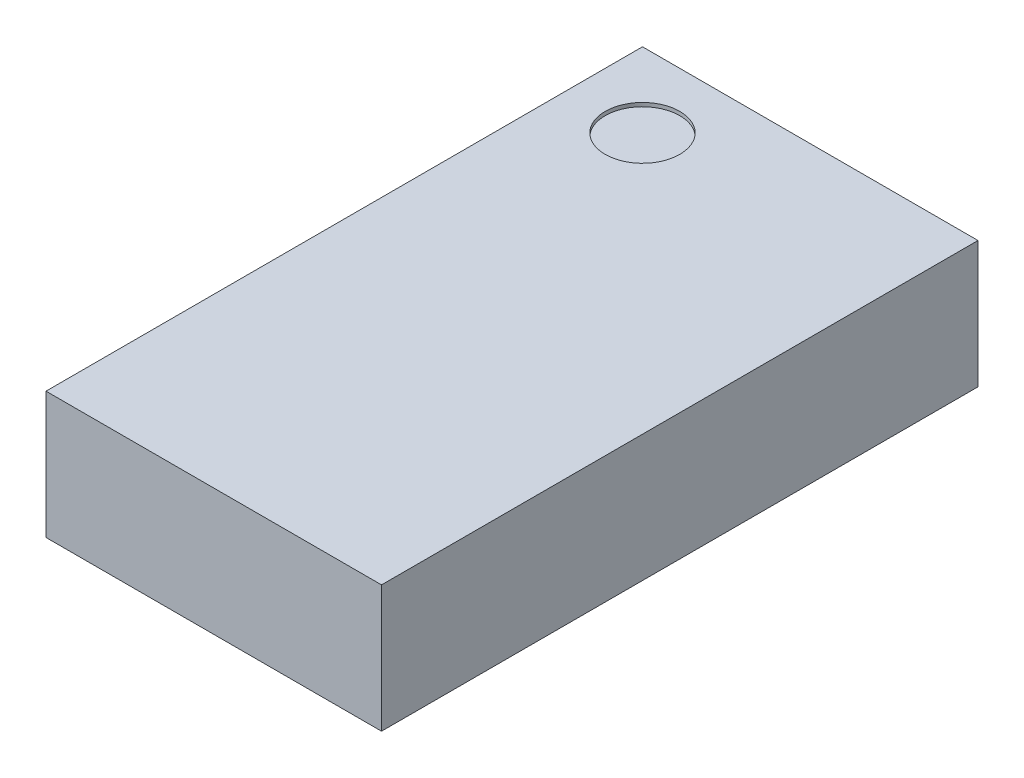
ISO-10303-21;
HEADER;
FILE_DESCRIPTION(('STEP AP214'),'2;1');
FILE_NAME('part.step','',(''),(''),'','','');
FILE_SCHEMA(('AUTOMOTIVE_DESIGN { 1 0 10303 214 1 1 1 1 }'));
ENDSEC;
DATA;
#1=APPLICATION_CONTEXT('core data for automotive mechanical design processes');
#2=APPLICATION_PROTOCOL_DEFINITION('international standard','automotive_design',2000,#1);
#3=PRODUCT_CONTEXT('',#1,'mechanical');
#4=PRODUCT('Part','Part','',(#3));
#5=PRODUCT_RELATED_PRODUCT_CATEGORY('part','',(#4));
#6=PRODUCT_DEFINITION_FORMATION('','',#4);
#7=PRODUCT_DEFINITION_CONTEXT('part definition',#1,'design');
#8=PRODUCT_DEFINITION('design','',#6,#7);
#9=PRODUCT_DEFINITION_SHAPE('','',#8);
#10=(LENGTH_UNIT() NAMED_UNIT(*) SI_UNIT(.MILLI.,.METRE.));
#11=(NAMED_UNIT(*) PLANE_ANGLE_UNIT() SI_UNIT($,.RADIAN.));
#12=(NAMED_UNIT(*) SI_UNIT($,.STERADIAN.) SOLID_ANGLE_UNIT());
#13=UNCERTAINTY_MEASURE_WITH_UNIT(LENGTH_MEASURE(1.E-05),#10,'distance_accuracy_value','');
#14=(GEOMETRIC_REPRESENTATION_CONTEXT(3) GLOBAL_UNCERTAINTY_ASSIGNED_CONTEXT((#13)) GLOBAL_UNIT_ASSIGNED_CONTEXT((#10,
#11,#12)) REPRESENTATION_CONTEXT('',''));
#15=CARTESIAN_POINT('',(0.,0.,0.));
#16=DIRECTION('',(0.,0.,1.));
#17=DIRECTION('',(1.,0.,0.));
#18=AXIS2_PLACEMENT_3D('',#15,#16,#17);
#19=CARTESIAN_POINT('',(0.45,2.83575597506858,0.8));
#20=DIRECTION('',(-1.,0.,0.));
#21=DIRECTION('',(0.,0.,1.));
#22=AXIS2_PLACEMENT_3D('',#19,#20,#21);
#23=PLANE('',#22);
#24=DIRECTION('',(0.,0.,-1.));
#25=VECTOR('',#24,1.);
#26=CARTESIAN_POINT('',(0.45,0.5,0.8));
#27=LINE('',#26,#25);
#28=CARTESIAN_POINT('',(0.45,0.5,0.8));
#29=VERTEX_POINT('',#28);
#30=CARTESIAN_POINT('',(0.45,0.5,-0.8));
#31=VERTEX_POINT('',#30);
#32=EDGE_CURVE('E96',#29,#31,#27,.T.);
#33=ORIENTED_EDGE('',*,*,#32,.F.);
#34=DIRECTION('',(0.,-1.,0.));
#35=VECTOR('',#34,1.);
#36=CARTESIAN_POINT('',(0.45,2.83575597506858,0.8));
#37=LINE('',#36,#35);
#38=CARTESIAN_POINT('',(0.45,0.16,0.8));
#39=VERTEX_POINT('',#38);
#40=EDGE_CURVE('E61',#29,#39,#37,.T.);
#41=ORIENTED_EDGE('',*,*,#40,.T.);
#42=DIRECTION('',(0.,0.,-1.));
#43=VECTOR('',#42,1.);
#44=CARTESIAN_POINT('',(0.45,0.16,0.8));
#45=LINE('',#44,#43);
#46=CARTESIAN_POINT('',(0.45,0.16,-0.8));
#47=VERTEX_POINT('',#46);
#48=EDGE_CURVE('E94',#39,#47,#45,.T.);
#49=ORIENTED_EDGE('',*,*,#48,.T.);
#50=DIRECTION('',(0.,-1.,0.));
#51=VECTOR('',#50,1.);
#52=CARTESIAN_POINT('',(0.45,2.83575597506858,-0.8));
#53=LINE('',#52,#51);
#54=EDGE_CURVE('E84',#31,#47,#53,.T.);
#55=ORIENTED_EDGE('',*,*,#54,.F.);
#56=EDGE_LOOP('',(#33,#41,#49,#55));
#57=FACE_BOUND('',#56,.T.);
#58=ADVANCED_FACE('F46',(#57),#23,.F.);
#59=CARTESIAN_POINT('',(-0.45,2.83575597506858,-0.8));
#60=DIRECTION('',(0.,0.,1.));
#61=DIRECTION('',(1.,0.,0.));
#62=AXIS2_PLACEMENT_3D('',#59,#60,#61);
#63=PLANE('',#62);
#64=DIRECTION('',(-1.,0.,0.));
#65=VECTOR('',#64,1.);
#66=CARTESIAN_POINT('',(-0.45,0.5,-0.8));
#67=LINE('',#66,#65);
#68=CARTESIAN_POINT('',(-0.45,0.5,-0.8));
#69=VERTEX_POINT('',#68);
#70=EDGE_CURVE('E90',#31,#69,#67,.T.);
#71=ORIENTED_EDGE('',*,*,#70,.F.);
#72=ORIENTED_EDGE('',*,*,#54,.T.);
#73=DIRECTION('',(-1.,0.,0.));
#74=VECTOR('',#73,1.);
#75=CARTESIAN_POINT('',(-0.45,0.16,-0.8));
#76=LINE('',#75,#74);
#77=CARTESIAN_POINT('',(-0.45,0.16,-0.8));
#78=VERTEX_POINT('',#77);
#79=EDGE_CURVE('E108',#47,#78,#76,.T.);
#80=ORIENTED_EDGE('',*,*,#79,.T.);
#81=DIRECTION('',(0.,-1.,0.));
#82=VECTOR('',#81,1.);
#83=CARTESIAN_POINT('',(-0.45,2.83575597506858,-0.8));
#84=LINE('',#83,#82);
#85=EDGE_CURVE('E121',#69,#78,#84,.T.);
#86=ORIENTED_EDGE('',*,*,#85,.F.);
#87=EDGE_LOOP('',(#71,#72,#80,#86));
#88=FACE_BOUND('',#87,.T.);
#89=ADVANCED_FACE('F168',(#88),#63,.F.);
#90=CARTESIAN_POINT('',(-0.45,2.83575597506858,0.8));
#91=DIRECTION('',(1.,0.,0.));
#92=DIRECTION('',(0.,0.,-1.));
#93=AXIS2_PLACEMENT_3D('',#90,#91,#92);
#94=PLANE('',#93);
#95=DIRECTION('',(0.,0.,1.));
#96=VECTOR('',#95,1.);
#97=CARTESIAN_POINT('',(-0.45,0.5,0.8));
#98=LINE('',#97,#96);
#99=CARTESIAN_POINT('',(-0.45,0.5,0.8));
#100=VERTEX_POINT('',#99);
#101=EDGE_CURVE('E114',#69,#100,#98,.T.);
#102=ORIENTED_EDGE('',*,*,#101,.F.);
#103=ORIENTED_EDGE('',*,*,#85,.T.);
#104=DIRECTION('',(0.,0.,1.));
#105=VECTOR('',#104,1.);
#106=CARTESIAN_POINT('',(-0.45,0.16,0.8));
#107=LINE('',#106,#105);
#108=CARTESIAN_POINT('',(-0.45,0.16,0.8));
#109=VERTEX_POINT('',#108);
#110=EDGE_CURVE('E123',#78,#109,#107,.T.);
#111=ORIENTED_EDGE('',*,*,#110,.T.);
#112=DIRECTION('',(0.,-1.,0.));
#113=VECTOR('',#112,1.);
#114=CARTESIAN_POINT('',(-0.45,2.83575597506858,0.8));
#115=LINE('',#114,#113);
#116=EDGE_CURVE('E67',#100,#109,#115,.T.);
#117=ORIENTED_EDGE('',*,*,#116,.F.);
#118=EDGE_LOOP('',(#102,#103,#111,#117));
#119=FACE_BOUND('',#118,.T.);
#120=ADVANCED_FACE('F172',(#119),#94,.F.);
#121=CARTESIAN_POINT('',(-0.45,2.83575597506858,0.8));
#122=DIRECTION('',(0.,0.,-1.));
#123=DIRECTION('',(-1.,0.,0.));
#124=AXIS2_PLACEMENT_3D('',#121,#122,#123);
#125=PLANE('',#124);
#126=DIRECTION('',(1.,0.,0.));
#127=VECTOR('',#126,1.);
#128=CARTESIAN_POINT('',(-0.45,0.5,0.8));
#129=LINE('',#128,#127);
#130=EDGE_CURVE('E105',#100,#29,#129,.T.);
#131=ORIENTED_EDGE('',*,*,#130,.F.);
#132=ORIENTED_EDGE('',*,*,#116,.T.);
#133=DIRECTION('',(1.,0.,0.));
#134=VECTOR('',#133,1.);
#135=CARTESIAN_POINT('',(-0.45,0.16,0.8));
#136=LINE('',#135,#134);
#137=EDGE_CURVE('E101',#109,#39,#136,.T.);
#138=ORIENTED_EDGE('',*,*,#137,.T.);
#139=ORIENTED_EDGE('',*,*,#40,.F.);
#140=EDGE_LOOP('',(#131,#132,#138,#139));
#141=FACE_BOUND('',#140,.T.);
#142=ADVANCED_FACE('F102',(#141),#125,.F.);
#143=CARTESIAN_POINT('',(0.,0.16,0.));
#144=DIRECTION('',(0.,-1.,0.));
#145=DIRECTION('',(0.,0.,-1.));
#146=AXIS2_PLACEMENT_3D('',#143,#144,#145);
#147=PLANE('',#146);
#148=CARTESIAN_POINT('',(0.2,0.16,-0.4));
#149=DIRECTION('',(0.,-1.,0.));
#150=DIRECTION('',(0.,0.,-1.));
#151=AXIS2_PLACEMENT_3D('',#148,#149,#150);
#152=CIRCLE('',#151,0.105830052442584);
#153=CARTESIAN_POINT('',(0.2,0.16,-0.505830052442584));
#154=VERTEX_POINT('',#153);
#155=EDGE_CURVE('E12',#154,#154,#152,.T.);
#156=ORIENTED_EDGE('',*,*,#155,.F.);
#157=EDGE_LOOP('',(#156));
#158=FACE_BOUND('',#157,.T.);
#159=CARTESIAN_POINT('',(0.2,0.16,0.4));
#160=DIRECTION('',(0.,-1.,0.));
#161=DIRECTION('',(0.,0.,-1.));
#162=AXIS2_PLACEMENT_3D('',#159,#160,#161);
#163=CIRCLE('',#162,0.105830052442584);
#164=CARTESIAN_POINT('',(0.2,0.16,0.294169947557416));
#165=VERTEX_POINT('',#164);
#166=EDGE_CURVE('E54',#165,#165,#163,.T.);
#167=ORIENTED_EDGE('',*,*,#166,.F.);
#168=EDGE_LOOP('',(#167));
#169=FACE_BOUND('',#168,.T.);
#170=CARTESIAN_POINT('',(0.2,0.16,0.));
#171=DIRECTION('',(0.,-1.,0.));
#172=DIRECTION('',(0.,0.,-1.));
#173=AXIS2_PLACEMENT_3D('',#170,#171,#172);
#174=CIRCLE('',#173,0.105830052442584);
#175=CARTESIAN_POINT('',(0.2,0.16,-0.105830052442584));
#176=VERTEX_POINT('',#175);
#177=EDGE_CURVE('E133',#176,#176,#174,.T.);
#178=ORIENTED_EDGE('',*,*,#177,.F.);
#179=EDGE_LOOP('',(#178));
#180=FACE_BOUND('',#179,.T.);
#181=CARTESIAN_POINT('',(-0.2,0.16,-0.4));
#182=DIRECTION('',(0.,-1.,0.));
#183=DIRECTION('',(0.,0.,-1.));
#184=AXIS2_PLACEMENT_3D('',#181,#182,#183);
#185=CIRCLE('',#184,0.105830052442584);
#186=CARTESIAN_POINT('',(-0.2,0.16,-0.505830052442584));
#187=VERTEX_POINT('',#186);
#188=EDGE_CURVE('E130',#187,#187,#185,.T.);
#189=ORIENTED_EDGE('',*,*,#188,.F.);
#190=EDGE_LOOP('',(#189));
#191=FACE_BOUND('',#190,.T.);
#192=CARTESIAN_POINT('',(-0.2,0.16,0.4));
#193=DIRECTION('',(0.,-1.,0.));
#194=DIRECTION('',(0.,0.,-1.));
#195=AXIS2_PLACEMENT_3D('',#192,#193,#194);
#196=CIRCLE('',#195,0.105830052442584);
#197=CARTESIAN_POINT('',(-0.2,0.16,0.294169947557416));
#198=VERTEX_POINT('',#197);
#199=EDGE_CURVE('E127',#198,#198,#196,.T.);
#200=ORIENTED_EDGE('',*,*,#199,.F.);
#201=EDGE_LOOP('',(#200));
#202=FACE_BOUND('',#201,.T.);
#203=CARTESIAN_POINT('',(-0.2,0.16,0.));
#204=DIRECTION('',(0.,-1.,0.));
#205=DIRECTION('',(0.,0.,-1.));
#206=AXIS2_PLACEMENT_3D('',#203,#204,#205);
#207=CIRCLE('',#206,0.105830052442584);
#208=CARTESIAN_POINT('',(-0.2,0.16,-0.105830052442584));
#209=VERTEX_POINT('',#208);
#210=EDGE_CURVE('E117',#209,#209,#207,.T.);
#211=ORIENTED_EDGE('',*,*,#210,.F.);
#212=EDGE_LOOP('',(#211));
#213=FACE_BOUND('',#212,.T.);
#214=ORIENTED_EDGE('',*,*,#48,.F.);
#215=ORIENTED_EDGE('',*,*,#137,.F.);
#216=ORIENTED_EDGE('',*,*,#110,.F.);
#217=ORIENTED_EDGE('',*,*,#79,.F.);
#218=EDGE_LOOP('',(#214,#215,#216,#217));
#219=FACE_BOUND('',#218,.T.);
#220=ADVANCED_FACE('F107',(#158,#169,#180,#191,#202,#213,#219),#147,.T.);
#221=CARTESIAN_POINT('',(0.,0.5,0.));
#222=DIRECTION('',(0.,1.,0.));
#223=DIRECTION('',(0.,0.,1.));
#224=AXIS2_PLACEMENT_3D('',#221,#222,#223);
#225=PLANE('',#224);
#226=CARTESIAN_POINT('',(-0.25,0.5,-0.6));
#227=DIRECTION('',(0.,1.,0.));
#228=DIRECTION('',(0.,0.,1.));
#229=AXIS2_PLACEMENT_3D('',#226,#227,#228);
#230=CIRCLE('',#229,0.1);
#231=CARTESIAN_POINT('',(-0.25,0.5,-0.5));
#232=VERTEX_POINT('',#231);
#233=EDGE_CURVE('E192',#232,#232,#230,.T.);
#234=ORIENTED_EDGE('',*,*,#233,.F.);
#235=EDGE_LOOP('',(#234));
#236=FACE_BOUND('',#235,.T.);
#237=ORIENTED_EDGE('',*,*,#130,.T.);
#238=ORIENTED_EDGE('',*,*,#32,.T.);
#239=ORIENTED_EDGE('',*,*,#70,.T.);
#240=ORIENTED_EDGE('',*,*,#101,.T.);
#241=EDGE_LOOP('',(#237,#238,#239,#240));
#242=FACE_BOUND('',#241,.T.);
#243=ADVANCED_FACE('F48',(#236,#242),#225,.T.);
#244=CARTESIAN_POINT('',(-0.25,0.49,-0.6));
#245=DIRECTION('',(0.,1.,0.));
#246=DIRECTION('',(0.,0.,1.));
#247=AXIS2_PLACEMENT_3D('',#244,#245,#246);
#248=CYLINDRICAL_SURFACE('',#247,0.1);
#249=CARTESIAN_POINT('',(-0.25,0.49,-0.6));
#250=DIRECTION('',(0.,1.,0.));
#251=DIRECTION('',(0.,0.,1.));
#252=AXIS2_PLACEMENT_3D('',#249,#250,#251);
#253=CIRCLE('',#252,0.1);
#254=CARTESIAN_POINT('',(-0.25,0.49,-0.5));
#255=VERTEX_POINT('',#254);
#256=EDGE_CURVE('E98',#255,#255,#253,.T.);
#257=ORIENTED_EDGE('',*,*,#256,.F.);
#258=EDGE_LOOP('',(#257));
#259=FACE_BOUND('',#258,.T.);
#260=ORIENTED_EDGE('',*,*,#233,.T.);
#261=EDGE_LOOP('',(#260));
#262=FACE_BOUND('',#261,.T.);
#263=ADVANCED_FACE('F164',(#259,#262),#248,.F.);
#264=CARTESIAN_POINT('',(-0.25,0.49,-0.6));
#265=DIRECTION('',(0.,1.,0.));
#266=DIRECTION('',(0.,0.,1.));
#267=AXIS2_PLACEMENT_3D('',#264,#265,#266);
#268=PLANE('',#267);
#269=ORIENTED_EDGE('',*,*,#256,.T.);
#270=EDGE_LOOP('',(#269));
#271=FACE_BOUND('',#270,.T.);
#272=ADVANCED_FACE('F155',(#271),#268,.T.);
#273=CARTESIAN_POINT('',(-0.2,0.115,0.));
#274=DIRECTION('',(0.,1.,0.));
#275=DIRECTION('',(1.,0.,0.));
#276=AXIS2_PLACEMENT_3D('',#273,#274,#275);
#277=SPHERICAL_SURFACE('',#276,0.115);
#278=ORIENTED_EDGE('',*,*,#210,.T.);
#279=EDGE_LOOP('',(#278));
#280=FACE_BOUND('',#279,.T.);
#281=ADVANCED_FACE('F152',(#280),#277,.T.);
#282=CARTESIAN_POINT('',(-0.2,0.115,0.4));
#283=DIRECTION('',(0.,1.,0.));
#284=DIRECTION('',(1.,0.,0.));
#285=AXIS2_PLACEMENT_3D('',#282,#283,#284);
#286=SPHERICAL_SURFACE('',#285,0.115);
#287=ORIENTED_EDGE('',*,*,#199,.T.);
#288=EDGE_LOOP('',(#287));
#289=FACE_BOUND('',#288,.T.);
#290=ADVANCED_FACE('F154',(#289),#286,.T.);
#291=CARTESIAN_POINT('',(-0.2,0.115,-0.4));
#292=DIRECTION('',(0.,1.,0.));
#293=DIRECTION('',(1.,0.,0.));
#294=AXIS2_PLACEMENT_3D('',#291,#292,#293);
#295=SPHERICAL_SURFACE('',#294,0.115);
#296=ORIENTED_EDGE('',*,*,#188,.T.);
#297=EDGE_LOOP('',(#296));
#298=FACE_BOUND('',#297,.T.);
#299=ADVANCED_FACE('F161',(#298),#295,.T.);
#300=CARTESIAN_POINT('',(0.2,0.115,0.));
#301=DIRECTION('',(0.,1.,0.));
#302=DIRECTION('',(-1.,0.,0.));
#303=AXIS2_PLACEMENT_3D('',#300,#301,#302);
#304=SPHERICAL_SURFACE('',#303,0.115);
#305=ORIENTED_EDGE('',*,*,#177,.T.);
#306=EDGE_LOOP('',(#305));
#307=FACE_BOUND('',#306,.T.);
#308=ADVANCED_FACE('F255',(#307),#304,.T.);
#309=CARTESIAN_POINT('',(0.2,0.115,0.4));
#310=DIRECTION('',(0.,1.,0.));
#311=DIRECTION('',(-1.,0.,0.));
#312=AXIS2_PLACEMENT_3D('',#309,#310,#311);
#313=SPHERICAL_SURFACE('',#312,0.115);
#314=ORIENTED_EDGE('',*,*,#166,.T.);
#315=EDGE_LOOP('',(#314));
#316=FACE_BOUND('',#315,.T.);
#317=ADVANCED_FACE('F138',(#316),#313,.T.);
#318=CARTESIAN_POINT('',(0.2,0.115,-0.4));
#319=DIRECTION('',(0.,1.,0.));
#320=DIRECTION('',(-1.,0.,0.));
#321=AXIS2_PLACEMENT_3D('',#318,#319,#320);
#322=SPHERICAL_SURFACE('',#321,0.115);
#323=ORIENTED_EDGE('',*,*,#155,.T.);
#324=EDGE_LOOP('',(#323));
#325=FACE_BOUND('',#324,.T.);
#326=ADVANCED_FACE('F274',(#325),#322,.T.);
#327=CLOSED_SHELL('',(#58,#89,#120,#142,#220,#243,#263,#272,#281,#290,#299,#308,#317,#326));
#328=MANIFOLD_SOLID_BREP('B2',#327);
#329=ADVANCED_BREP_SHAPE_REPRESENTATION('',(#18,#328),#14);
#330=SHAPE_DEFINITION_REPRESENTATION(#9,#329);
ENDSEC;
END-ISO-10303-21;
